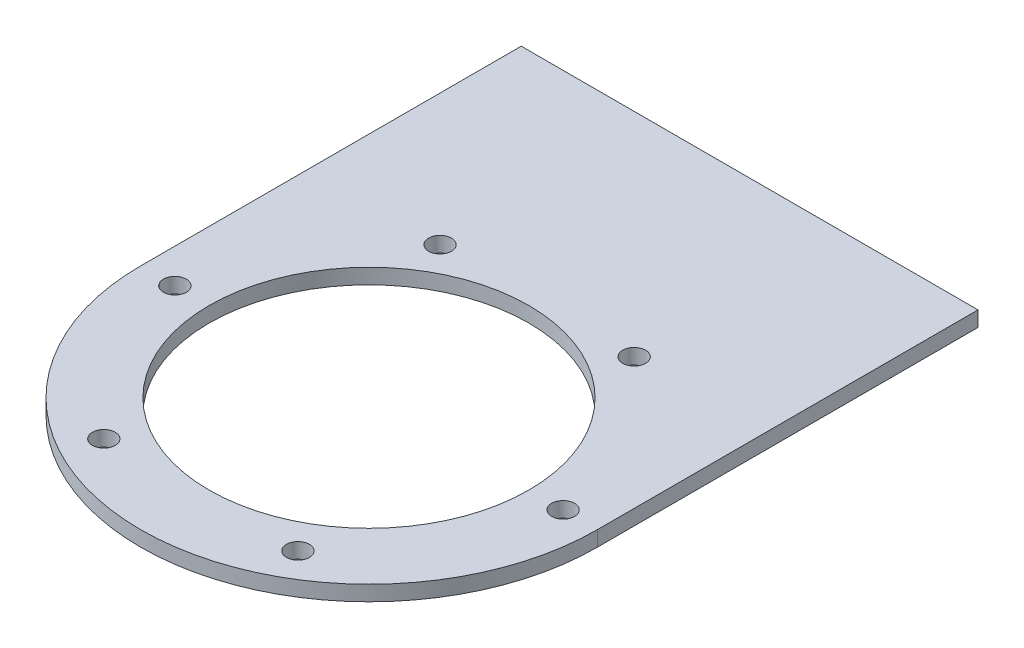
ISO-10303-21;
HEADER;
FILE_DESCRIPTION(('STEP AP214'),'2;1');
FILE_NAME('part.step','',(''),(''),'','','');
FILE_SCHEMA(('AUTOMOTIVE_DESIGN { 1 0 10303 214 1 1 1 1 }'));
ENDSEC;
DATA;
#1=APPLICATION_CONTEXT('core data for automotive mechanical design processes');
#2=APPLICATION_PROTOCOL_DEFINITION('international standard','automotive_design',2000,#1);
#3=PRODUCT_CONTEXT('',#1,'mechanical');
#4=PRODUCT('Part','Part','',(#3));
#5=PRODUCT_RELATED_PRODUCT_CATEGORY('part','',(#4));
#6=PRODUCT_DEFINITION_FORMATION('','',#4);
#7=PRODUCT_DEFINITION_CONTEXT('part definition',#1,'design');
#8=PRODUCT_DEFINITION('design','',#6,#7);
#9=PRODUCT_DEFINITION_SHAPE('','',#8);
#10=(LENGTH_UNIT() NAMED_UNIT(*) SI_UNIT(.MILLI.,.METRE.));
#11=(NAMED_UNIT(*) PLANE_ANGLE_UNIT() SI_UNIT($,.RADIAN.));
#12=(NAMED_UNIT(*) SI_UNIT($,.STERADIAN.) SOLID_ANGLE_UNIT());
#13=UNCERTAINTY_MEASURE_WITH_UNIT(LENGTH_MEASURE(1.E-05),#10,'distance_accuracy_value','');
#14=(GEOMETRIC_REPRESENTATION_CONTEXT(3) GLOBAL_UNCERTAINTY_ASSIGNED_CONTEXT((#13)) GLOBAL_UNIT_ASSIGNED_CONTEXT((#10,
#11,#12)) REPRESENTATION_CONTEXT('',''));
#15=CARTESIAN_POINT('',(0.,0.,0.));
#16=DIRECTION('',(0.,0.,1.));
#17=DIRECTION('',(1.,0.,0.));
#18=AXIS2_PLACEMENT_3D('',#15,#16,#17);
#19=CARTESIAN_POINT('',(0.,2.,0.));
#20=DIRECTION('',(0.,1.,0.));
#21=DIRECTION('',(0.,0.,1.));
#22=AXIS2_PLACEMENT_3D('',#19,#20,#21);
#23=PLANE('',#22);
#24=CARTESIAN_POINT('',(-12.7499999999999,2.,22.0836477965032));
#25=DIRECTION('',(0.,1.,0.));
#26=DIRECTION('',(0.,0.,1.));
#27=AXIS2_PLACEMENT_3D('',#24,#25,#26);
#28=CIRCLE('',#27,1.5);
#29=CARTESIAN_POINT('',(-12.7499999999999,2.,23.5836477965032));
#30=VERTEX_POINT('',#29);
#31=EDGE_CURVE('E139',#30,#30,#28,.T.);
#32=ORIENTED_EDGE('',*,*,#31,.F.);
#33=EDGE_LOOP('',(#32));
#34=FACE_BOUND('',#33,.T.);
#35=CARTESIAN_POINT('',(25.5,2.,0.));
#36=DIRECTION('',(0.,1.,0.));
#37=DIRECTION('',(0.,0.,1.));
#38=AXIS2_PLACEMENT_3D('',#35,#36,#37);
#39=CIRCLE('',#38,1.5);
#40=CARTESIAN_POINT('',(25.5,2.,1.5));
#41=VERTEX_POINT('',#40);
#42=EDGE_CURVE('E127',#41,#41,#39,.T.);
#43=ORIENTED_EDGE('',*,*,#42,.F.);
#44=EDGE_LOOP('',(#43));
#45=FACE_BOUND('',#44,.T.);
#46=CARTESIAN_POINT('',(-12.7499999999999,2.,-22.0836477965032));
#47=DIRECTION('',(0.,1.,0.));
#48=DIRECTION('',(0.,0.,1.));
#49=AXIS2_PLACEMENT_3D('',#46,#47,#48);
#50=CIRCLE('',#49,1.50000000000001);
#51=CARTESIAN_POINT('',(-12.7499999999999,2.,-20.5836477965032));
#52=VERTEX_POINT('',#51);
#53=EDGE_CURVE('E115',#52,#52,#50,.T.);
#54=ORIENTED_EDGE('',*,*,#53,.F.);
#55=EDGE_LOOP('',(#54));
#56=FACE_BOUND('',#55,.T.);
#57=CARTESIAN_POINT('',(0.,2.,0.));
#58=DIRECTION('',(0.,1.,0.));
#59=DIRECTION('',(0.,0.,1.));
#60=AXIS2_PLACEMENT_3D('',#57,#58,#59);
#61=CIRCLE('',#60,30.);
#62=CARTESIAN_POINT('',(-30.,2.,0.));
#63=VERTEX_POINT('',#62);
#64=CARTESIAN_POINT('',(30.,2.,0.));
#65=VERTEX_POINT('',#64);
#66=EDGE_CURVE('E85',#63,#65,#61,.T.);
#67=ORIENTED_EDGE('',*,*,#66,.T.);
#68=DIRECTION('',(0.,0.,-1.));
#69=VECTOR('',#68,1.);
#70=CARTESIAN_POINT('',(30.,2.,-50.));
#71=LINE('',#70,#69);
#72=CARTESIAN_POINT('',(30.,2.,-50.));
#73=VERTEX_POINT('',#72);
#74=EDGE_CURVE('E80',#65,#73,#71,.T.);
#75=ORIENTED_EDGE('',*,*,#74,.T.);
#76=DIRECTION('',(-1.,0.,0.));
#77=VECTOR('',#76,1.);
#78=CARTESIAN_POINT('',(-30.,2.,-50.));
#79=LINE('',#78,#77);
#80=CARTESIAN_POINT('',(-30.,2.,-50.));
#81=VERTEX_POINT('',#80);
#82=EDGE_CURVE('E83',#73,#81,#79,.T.);
#83=ORIENTED_EDGE('',*,*,#82,.T.);
#84=DIRECTION('',(0.,0.,1.));
#85=VECTOR('',#84,1.);
#86=CARTESIAN_POINT('',(-30.,2.,0.));
#87=LINE('',#86,#85);
#88=EDGE_CURVE('E50',#81,#63,#87,.T.);
#89=ORIENTED_EDGE('',*,*,#88,.T.);
#90=EDGE_LOOP('',(#67,#75,#83,#89));
#91=FACE_BOUND('',#90,.T.);
#92=CARTESIAN_POINT('',(0.,2.,0.));
#93=DIRECTION('',(0.,1.,0.));
#94=DIRECTION('',(0.,0.,1.));
#95=AXIS2_PLACEMENT_3D('',#92,#93,#94);
#96=CIRCLE('',#95,21.);
#97=CARTESIAN_POINT('',(0.,2.,21.));
#98=VERTEX_POINT('',#97);
#99=EDGE_CURVE('E100',#98,#98,#96,.T.);
#100=ORIENTED_EDGE('',*,*,#99,.F.);
#101=EDGE_LOOP('',(#100));
#102=FACE_BOUND('',#101,.T.);
#103=CARTESIAN_POINT('',(12.7499999999999,2.,-22.0836477965032));
#104=DIRECTION('',(0.,1.,0.));
#105=DIRECTION('',(0.,0.,1.));
#106=AXIS2_PLACEMENT_3D('',#103,#104,#105);
#107=CIRCLE('',#106,1.5);
#108=CARTESIAN_POINT('',(12.7499999999999,2.,-20.5836477965032));
#109=VERTEX_POINT('',#108);
#110=EDGE_CURVE('E121',#109,#109,#107,.T.);
#111=ORIENTED_EDGE('',*,*,#110,.F.);
#112=EDGE_LOOP('',(#111));
#113=FACE_BOUND('',#112,.T.);
#114=CARTESIAN_POINT('',(12.75,2.,22.0836477965032));
#115=DIRECTION('',(0.,1.,0.));
#116=DIRECTION('',(0.,0.,1.));
#117=AXIS2_PLACEMENT_3D('',#114,#115,#116);
#118=CIRCLE('',#117,1.50000000000001);
#119=CARTESIAN_POINT('',(12.75,2.,23.5836477965032));
#120=VERTEX_POINT('',#119);
#121=EDGE_CURVE('E133',#120,#120,#118,.T.);
#122=ORIENTED_EDGE('',*,*,#121,.F.);
#123=EDGE_LOOP('',(#122));
#124=FACE_BOUND('',#123,.T.);
#125=CARTESIAN_POINT('',(-25.5,2.,0.));
#126=DIRECTION('',(0.,1.,0.));
#127=DIRECTION('',(0.,0.,1.));
#128=AXIS2_PLACEMENT_3D('',#125,#126,#127);
#129=CIRCLE('',#128,1.5);
#130=CARTESIAN_POINT('',(-25.5,2.,1.5));
#131=VERTEX_POINT('',#130);
#132=EDGE_CURVE('E145',#131,#131,#129,.T.);
#133=ORIENTED_EDGE('',*,*,#132,.F.);
#134=EDGE_LOOP('',(#133));
#135=FACE_BOUND('',#134,.T.);
#136=ADVANCED_FACE('F33',(#34,#45,#56,#91,#102,#113,#124,#135),#23,.T.);
#137=CARTESIAN_POINT('',(0.,0.,0.));
#138=DIRECTION('',(0.,1.,0.));
#139=DIRECTION('',(0.,0.,1.));
#140=AXIS2_PLACEMENT_3D('',#137,#138,#139);
#141=PLANE('',#140);
#142=CARTESIAN_POINT('',(0.,0.,0.));
#143=DIRECTION('',(0.,1.,0.));
#144=DIRECTION('',(0.,0.,1.));
#145=AXIS2_PLACEMENT_3D('',#142,#143,#144);
#146=CIRCLE('',#145,30.);
#147=CARTESIAN_POINT('',(-30.,0.,0.));
#148=VERTEX_POINT('',#147);
#149=CARTESIAN_POINT('',(30.,0.,0.));
#150=VERTEX_POINT('',#149);
#151=EDGE_CURVE('E97',#148,#150,#146,.T.);
#152=ORIENTED_EDGE('',*,*,#151,.F.);
#153=DIRECTION('',(0.,0.,1.));
#154=VECTOR('',#153,1.);
#155=CARTESIAN_POINT('',(-30.,0.,0.));
#156=LINE('',#155,#154);
#157=CARTESIAN_POINT('',(-30.,0.,-50.));
#158=VERTEX_POINT('',#157);
#159=EDGE_CURVE('E73',#158,#148,#156,.T.);
#160=ORIENTED_EDGE('',*,*,#159,.F.);
#161=DIRECTION('',(-1.,0.,0.));
#162=VECTOR('',#161,1.);
#163=CARTESIAN_POINT('',(-30.,0.,-50.));
#164=LINE('',#163,#162);
#165=CARTESIAN_POINT('',(30.,0.,-50.));
#166=VERTEX_POINT('',#165);
#167=EDGE_CURVE('E67',#166,#158,#164,.T.);
#168=ORIENTED_EDGE('',*,*,#167,.F.);
#169=DIRECTION('',(0.,0.,-1.));
#170=VECTOR('',#169,1.);
#171=CARTESIAN_POINT('',(30.,0.,-50.));
#172=LINE('',#171,#170);
#173=EDGE_CURVE('E89',#150,#166,#172,.T.);
#174=ORIENTED_EDGE('',*,*,#173,.F.);
#175=EDGE_LOOP('',(#152,#160,#168,#174));
#176=FACE_BOUND('',#175,.T.);
#177=CARTESIAN_POINT('',(0.,0.,0.));
#178=DIRECTION('',(0.,1.,0.));
#179=DIRECTION('',(0.,0.,1.));
#180=AXIS2_PLACEMENT_3D('',#177,#178,#179);
#181=CIRCLE('',#180,21.);
#182=CARTESIAN_POINT('',(0.,0.,21.));
#183=VERTEX_POINT('',#182);
#184=EDGE_CURVE('E112',#183,#183,#181,.T.);
#185=ORIENTED_EDGE('',*,*,#184,.T.);
#186=EDGE_LOOP('',(#185));
#187=FACE_BOUND('',#186,.T.);
#188=CARTESIAN_POINT('',(-12.7499999999999,0.,-22.0836477965032));
#189=DIRECTION('',(0.,1.,0.));
#190=DIRECTION('',(0.,0.,1.));
#191=AXIS2_PLACEMENT_3D('',#188,#189,#190);
#192=CIRCLE('',#191,1.50000000000001);
#193=CARTESIAN_POINT('',(-12.7499999999999,0.,-20.5836477965032));
#194=VERTEX_POINT('',#193);
#195=EDGE_CURVE('E118',#194,#194,#192,.T.);
#196=ORIENTED_EDGE('',*,*,#195,.T.);
#197=EDGE_LOOP('',(#196));
#198=FACE_BOUND('',#197,.T.);
#199=CARTESIAN_POINT('',(12.7499999999999,0.,-22.0836477965032));
#200=DIRECTION('',(0.,1.,0.));
#201=DIRECTION('',(0.,0.,1.));
#202=AXIS2_PLACEMENT_3D('',#199,#200,#201);
#203=CIRCLE('',#202,1.5);
#204=CARTESIAN_POINT('',(12.7499999999999,0.,-20.5836477965032));
#205=VERTEX_POINT('',#204);
#206=EDGE_CURVE('E124',#205,#205,#203,.T.);
#207=ORIENTED_EDGE('',*,*,#206,.T.);
#208=EDGE_LOOP('',(#207));
#209=FACE_BOUND('',#208,.T.);
#210=CARTESIAN_POINT('',(25.5,0.,0.));
#211=DIRECTION('',(0.,1.,0.));
#212=DIRECTION('',(0.,0.,1.));
#213=AXIS2_PLACEMENT_3D('',#210,#211,#212);
#214=CIRCLE('',#213,1.5);
#215=CARTESIAN_POINT('',(25.5,0.,1.5));
#216=VERTEX_POINT('',#215);
#217=EDGE_CURVE('E130',#216,#216,#214,.T.);
#218=ORIENTED_EDGE('',*,*,#217,.T.);
#219=EDGE_LOOP('',(#218));
#220=FACE_BOUND('',#219,.T.);
#221=CARTESIAN_POINT('',(12.75,0.,22.0836477965032));
#222=DIRECTION('',(0.,1.,0.));
#223=DIRECTION('',(0.,0.,1.));
#224=AXIS2_PLACEMENT_3D('',#221,#222,#223);
#225=CIRCLE('',#224,1.50000000000001);
#226=CARTESIAN_POINT('',(12.75,0.,23.5836477965032));
#227=VERTEX_POINT('',#226);
#228=EDGE_CURVE('E136',#227,#227,#225,.T.);
#229=ORIENTED_EDGE('',*,*,#228,.T.);
#230=EDGE_LOOP('',(#229));
#231=FACE_BOUND('',#230,.T.);
#232=CARTESIAN_POINT('',(-12.7499999999999,0.,22.0836477965032));
#233=DIRECTION('',(0.,1.,0.));
#234=DIRECTION('',(0.,0.,1.));
#235=AXIS2_PLACEMENT_3D('',#232,#233,#234);
#236=CIRCLE('',#235,1.5);
#237=CARTESIAN_POINT('',(-12.7499999999999,0.,23.5836477965032));
#238=VERTEX_POINT('',#237);
#239=EDGE_CURVE('E142',#238,#238,#236,.T.);
#240=ORIENTED_EDGE('',*,*,#239,.T.);
#241=EDGE_LOOP('',(#240));
#242=FACE_BOUND('',#241,.T.);
#243=CARTESIAN_POINT('',(-25.5,0.,0.));
#244=DIRECTION('',(0.,1.,0.));
#245=DIRECTION('',(0.,0.,1.));
#246=AXIS2_PLACEMENT_3D('',#243,#244,#245);
#247=CIRCLE('',#246,1.5);
#248=CARTESIAN_POINT('',(-25.5,0.,1.5));
#249=VERTEX_POINT('',#248);
#250=EDGE_CURVE('E148',#249,#249,#247,.T.);
#251=ORIENTED_EDGE('',*,*,#250,.T.);
#252=EDGE_LOOP('',(#251));
#253=FACE_BOUND('',#252,.T.);
#254=ADVANCED_FACE('F108',(#176,#187,#198,#209,#220,#231,#242,#253),#141,.F.);
#255=CARTESIAN_POINT('',(0.,2.,0.));
#256=DIRECTION('',(0.,-1.,0.));
#257=DIRECTION('',(0.,0.,-1.));
#258=AXIS2_PLACEMENT_3D('',#255,#256,#257);
#259=CYLINDRICAL_SURFACE('',#258,30.);
#260=ORIENTED_EDGE('',*,*,#151,.T.);
#261=DIRECTION('',(0.,-1.,0.));
#262=VECTOR('',#261,1.);
#263=CARTESIAN_POINT('',(30.,2.,0.));
#264=LINE('',#263,#262);
#265=EDGE_CURVE('E11',#65,#150,#264,.T.);
#266=ORIENTED_EDGE('',*,*,#265,.F.);
#267=ORIENTED_EDGE('',*,*,#66,.F.);
#268=DIRECTION('',(0.,-1.,0.));
#269=VECTOR('',#268,1.);
#270=CARTESIAN_POINT('',(-30.,2.,0.));
#271=LINE('',#270,#269);
#272=EDGE_CURVE('E93',#63,#148,#271,.T.);
#273=ORIENTED_EDGE('',*,*,#272,.T.);
#274=EDGE_LOOP('',(#260,#266,#267,#273));
#275=FACE_BOUND('',#274,.T.);
#276=ADVANCED_FACE('F35',(#275),#259,.T.);
#277=CARTESIAN_POINT('',(30.,2.,-50.));
#278=DIRECTION('',(-1.,0.,0.));
#279=DIRECTION('',(0.,0.,1.));
#280=AXIS2_PLACEMENT_3D('',#277,#278,#279);
#281=PLANE('',#280);
#282=ORIENTED_EDGE('',*,*,#173,.T.);
#283=DIRECTION('',(0.,-1.,0.));
#284=VECTOR('',#283,1.);
#285=CARTESIAN_POINT('',(30.,2.,-50.));
#286=LINE('',#285,#284);
#287=EDGE_CURVE('E42',#73,#166,#286,.T.);
#288=ORIENTED_EDGE('',*,*,#287,.F.);
#289=ORIENTED_EDGE('',*,*,#74,.F.);
#290=ORIENTED_EDGE('',*,*,#265,.T.);
#291=EDGE_LOOP('',(#282,#288,#289,#290));
#292=FACE_BOUND('',#291,.T.);
#293=ADVANCED_FACE('F88',(#292),#281,.F.);
#294=CARTESIAN_POINT('',(-30.,2.,-50.));
#295=DIRECTION('',(0.,0.,1.));
#296=DIRECTION('',(1.,0.,0.));
#297=AXIS2_PLACEMENT_3D('',#294,#295,#296);
#298=PLANE('',#297);
#299=ORIENTED_EDGE('',*,*,#167,.T.);
#300=DIRECTION('',(0.,-1.,0.));
#301=VECTOR('',#300,1.);
#302=CARTESIAN_POINT('',(-30.,2.,-50.));
#303=LINE('',#302,#301);
#304=EDGE_CURVE('E90',#81,#158,#303,.T.);
#305=ORIENTED_EDGE('',*,*,#304,.F.);
#306=ORIENTED_EDGE('',*,*,#82,.F.);
#307=ORIENTED_EDGE('',*,*,#287,.T.);
#308=EDGE_LOOP('',(#299,#305,#306,#307));
#309=FACE_BOUND('',#308,.T.);
#310=ADVANCED_FACE('F91',(#309),#298,.F.);
#311=CARTESIAN_POINT('',(-30.,2.,0.));
#312=DIRECTION('',(1.,0.,0.));
#313=DIRECTION('',(0.,0.,-1.));
#314=AXIS2_PLACEMENT_3D('',#311,#312,#313);
#315=PLANE('',#314);
#316=ORIENTED_EDGE('',*,*,#159,.T.);
#317=ORIENTED_EDGE('',*,*,#272,.F.);
#318=ORIENTED_EDGE('',*,*,#88,.F.);
#319=ORIENTED_EDGE('',*,*,#304,.T.);
#320=EDGE_LOOP('',(#316,#317,#318,#319));
#321=FACE_BOUND('',#320,.T.);
#322=ADVANCED_FACE('F105',(#321),#315,.F.);
#323=CARTESIAN_POINT('',(0.,2.,0.));
#324=DIRECTION('',(0.,-1.,0.));
#325=DIRECTION('',(0.,0.,-1.));
#326=AXIS2_PLACEMENT_3D('',#323,#324,#325);
#327=CYLINDRICAL_SURFACE('',#326,21.);
#328=ORIENTED_EDGE('',*,*,#99,.T.);
#329=EDGE_LOOP('',(#328));
#330=FACE_BOUND('',#329,.T.);
#331=ORIENTED_EDGE('',*,*,#184,.F.);
#332=EDGE_LOOP('',(#331));
#333=FACE_BOUND('',#332,.T.);
#334=ADVANCED_FACE('F167',(#330,#333),#327,.F.);
#335=CARTESIAN_POINT('',(-12.7499999999999,2.,-22.0836477965032));
#336=DIRECTION('',(0.,-1.,0.));
#337=DIRECTION('',(0.,0.,-1.));
#338=AXIS2_PLACEMENT_3D('',#335,#336,#337);
#339=CYLINDRICAL_SURFACE('',#338,1.50000000000001);
#340=ORIENTED_EDGE('',*,*,#53,.T.);
#341=EDGE_LOOP('',(#340));
#342=FACE_BOUND('',#341,.T.);
#343=ORIENTED_EDGE('',*,*,#195,.F.);
#344=EDGE_LOOP('',(#343));
#345=FACE_BOUND('',#344,.T.);
#346=ADVANCED_FACE('F213',(#342,#345),#339,.F.);
#347=CARTESIAN_POINT('',(12.7499999999999,2.,-22.0836477965032));
#348=DIRECTION('',(0.,-1.,0.));
#349=DIRECTION('',(0.,0.,-1.));
#350=AXIS2_PLACEMENT_3D('',#347,#348,#349);
#351=CYLINDRICAL_SURFACE('',#350,1.5);
#352=ORIENTED_EDGE('',*,*,#110,.T.);
#353=EDGE_LOOP('',(#352));
#354=FACE_BOUND('',#353,.T.);
#355=ORIENTED_EDGE('',*,*,#206,.F.);
#356=EDGE_LOOP('',(#355));
#357=FACE_BOUND('',#356,.T.);
#358=ADVANCED_FACE('F221',(#354,#357),#351,.F.);
#359=CARTESIAN_POINT('',(25.5,2.,0.));
#360=DIRECTION('',(0.,-1.,0.));
#361=DIRECTION('',(0.,0.,-1.));
#362=AXIS2_PLACEMENT_3D('',#359,#360,#361);
#363=CYLINDRICAL_SURFACE('',#362,1.5);
#364=ORIENTED_EDGE('',*,*,#42,.T.);
#365=EDGE_LOOP('',(#364));
#366=FACE_BOUND('',#365,.T.);
#367=ORIENTED_EDGE('',*,*,#217,.F.);
#368=EDGE_LOOP('',(#367));
#369=FACE_BOUND('',#368,.T.);
#370=ADVANCED_FACE('F229',(#366,#369),#363,.F.);
#371=CARTESIAN_POINT('',(12.75,2.,22.0836477965032));
#372=DIRECTION('',(0.,-1.,0.));
#373=DIRECTION('',(0.,0.,-1.));
#374=AXIS2_PLACEMENT_3D('',#371,#372,#373);
#375=CYLINDRICAL_SURFACE('',#374,1.50000000000001);
#376=ORIENTED_EDGE('',*,*,#121,.T.);
#377=EDGE_LOOP('',(#376));
#378=FACE_BOUND('',#377,.T.);
#379=ORIENTED_EDGE('',*,*,#228,.F.);
#380=EDGE_LOOP('',(#379));
#381=FACE_BOUND('',#380,.T.);
#382=ADVANCED_FACE('F238',(#378,#381),#375,.F.);
#383=CARTESIAN_POINT('',(-12.7499999999999,2.,22.0836477965032));
#384=DIRECTION('',(0.,-1.,0.));
#385=DIRECTION('',(0.,0.,-1.));
#386=AXIS2_PLACEMENT_3D('',#383,#384,#385);
#387=CYLINDRICAL_SURFACE('',#386,1.5);
#388=ORIENTED_EDGE('',*,*,#31,.T.);
#389=EDGE_LOOP('',(#388));
#390=FACE_BOUND('',#389,.T.);
#391=ORIENTED_EDGE('',*,*,#239,.F.);
#392=EDGE_LOOP('',(#391));
#393=FACE_BOUND('',#392,.T.);
#394=ADVANCED_FACE('F247',(#390,#393),#387,.F.);
#395=CARTESIAN_POINT('',(-25.5,2.,0.));
#396=DIRECTION('',(0.,-1.,0.));
#397=DIRECTION('',(0.,0.,-1.));
#398=AXIS2_PLACEMENT_3D('',#395,#396,#397);
#399=CYLINDRICAL_SURFACE('',#398,1.5);
#400=ORIENTED_EDGE('',*,*,#132,.T.);
#401=EDGE_LOOP('',(#400));
#402=FACE_BOUND('',#401,.T.);
#403=ORIENTED_EDGE('',*,*,#250,.F.);
#404=EDGE_LOOP('',(#403));
#405=FACE_BOUND('',#404,.T.);
#406=ADVANCED_FACE('F154',(#402,#405),#399,.F.);
#407=CLOSED_SHELL('',(#136,#254,#276,#293,#310,#322,#334,#346,#358,#370,#382,#394,#406));
#408=MANIFOLD_SOLID_BREP('B2',#407);
#409=ADVANCED_BREP_SHAPE_REPRESENTATION('',(#18,#408),#14);
#410=SHAPE_DEFINITION_REPRESENTATION(#9,#409);
ENDSEC;
END-ISO-10303-21;
